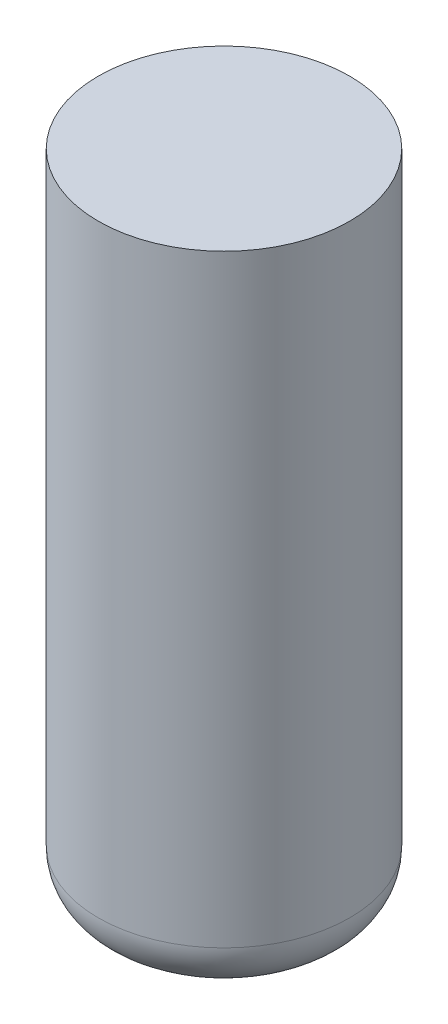
ISO-10303-21;
HEADER;
FILE_DESCRIPTION(('STEP AP214'),'2;1');
FILE_NAME('part.step','',(''),(''),'','','');
FILE_SCHEMA(('AUTOMOTIVE_DESIGN { 1 0 10303 214 1 1 1 1 }'));
ENDSEC;
DATA;
#1=APPLICATION_CONTEXT('core data for automotive mechanical design processes');
#2=APPLICATION_PROTOCOL_DEFINITION('international standard','automotive_design',2000,#1);
#3=PRODUCT_CONTEXT('',#1,'mechanical');
#4=PRODUCT('Part','Part','',(#3));
#5=PRODUCT_RELATED_PRODUCT_CATEGORY('part','',(#4));
#6=PRODUCT_DEFINITION_FORMATION('','',#4);
#7=PRODUCT_DEFINITION_CONTEXT('part definition',#1,'design');
#8=PRODUCT_DEFINITION('design','',#6,#7);
#9=PRODUCT_DEFINITION_SHAPE('','',#8);
#10=(LENGTH_UNIT() NAMED_UNIT(*) SI_UNIT(.MILLI.,.METRE.));
#11=(NAMED_UNIT(*) PLANE_ANGLE_UNIT() SI_UNIT($,.RADIAN.));
#12=(NAMED_UNIT(*) SI_UNIT($,.STERADIAN.) SOLID_ANGLE_UNIT());
#13=UNCERTAINTY_MEASURE_WITH_UNIT(LENGTH_MEASURE(1.E-05),#10,'distance_accuracy_value','');
#14=(GEOMETRIC_REPRESENTATION_CONTEXT(3) GLOBAL_UNCERTAINTY_ASSIGNED_CONTEXT((#13)) GLOBAL_UNIT_ASSIGNED_CONTEXT((#10,
#11,#12)) REPRESENTATION_CONTEXT('',''));
#15=CARTESIAN_POINT('',(0.,0.,0.));
#16=DIRECTION('',(0.,0.,1.));
#17=DIRECTION('',(1.,0.,0.));
#18=AXIS2_PLACEMENT_3D('',#15,#16,#17);
#19=CARTESIAN_POINT('',(-2.5,-1.8,5.960464455335E-08));
#20=DIRECTION('',(0.,-1.,0.));
#21=DIRECTION('',(0.,0.,-1.));
#22=AXIS2_PLACEMENT_3D('',#19,#20,#21);
#23=TOROIDAL_SURFACE('',#22,0.3,0.2);
#24=CARTESIAN_POINT('',(-2.5,-2.,5.960464455335E-08));
#25=DIRECTION('',(0.,1.,0.));
#26=DIRECTION('',(1.,0.,0.));
#27=AXIS2_PLACEMENT_3D('',#24,#25,#26);
#28=CIRCLE('',#27,0.3);
#29=CARTESIAN_POINT('',(-2.8,-2.,5.960464459009E-08));
#30=VERTEX_POINT('',#29);
#31=CARTESIAN_POINT('',(-2.5,-2.,0.300000059605));
#32=VERTEX_POINT('',#31);
#33=EDGE_CURVE('E11',#30,#32,#28,.T.);
#34=ORIENTED_EDGE('',*,*,#33,.T.);
#35=CARTESIAN_POINT('',(-2.5,-1.8,0.300000059605));
#36=DIRECTION('',(-1.,0.,0.));
#37=DIRECTION('',(0.,0.,1.));
#38=AXIS2_PLACEMENT_3D('',#35,#36,#37);
#39=CIRCLE('',#38,0.2);
#40=CARTESIAN_POINT('',(-2.5,-1.8,0.500000059605));
#41=VERTEX_POINT('',#40);
#42=EDGE_CURVE('E24',#32,#41,#39,.T.);
#43=ORIENTED_EDGE('',*,*,#42,.T.);
#44=CARTESIAN_POINT('',(-2.5,-1.8,5.960464455335E-08));
#45=DIRECTION('',(0.,-1.,0.));
#46=DIRECTION('',(1.,0.,0.));
#47=AXIS2_PLACEMENT_3D('',#44,#45,#46);
#48=CIRCLE('',#47,0.5);
#49=CARTESIAN_POINT('',(-3.,-1.8,5.960464449211E-08));
#50=VERTEX_POINT('',#49);
#51=EDGE_CURVE('E58',#41,#50,#48,.T.);
#52=ORIENTED_EDGE('',*,*,#51,.T.);
#53=CARTESIAN_POINT('',(-2.5,-1.8,5.960464455335E-08));
#54=DIRECTION('',(0.,-1.,0.));
#55=DIRECTION('',(1.,0.,0.));
#56=AXIS2_PLACEMENT_3D('',#53,#54,#55);
#57=CIRCLE('',#56,0.5);
#58=EDGE_CURVE('E51',#50,#41,#57,.T.);
#59=ORIENTED_EDGE('',*,*,#58,.T.);
#60=ORIENTED_EDGE('',*,*,#42,.F.);
#61=CARTESIAN_POINT('',(-2.5,-2.,5.960464455335E-08));
#62=DIRECTION('',(0.,1.,0.));
#63=DIRECTION('',(1.,0.,0.));
#64=AXIS2_PLACEMENT_3D('',#61,#62,#63);
#65=CIRCLE('',#64,0.3);
#66=EDGE_CURVE('E52',#32,#30,#65,.T.);
#67=ORIENTED_EDGE('',*,*,#66,.T.);
#68=EDGE_LOOP('',(#34,#43,#52,#59,#60,#67));
#69=FACE_BOUND('',#68,.T.);
#70=ADVANCED_FACE('F17',(#69),#23,.T.);
#71=CARTESIAN_POINT('',(-2.5,0.6,5.960464455335E-08));
#72=DIRECTION('',(0.,-1.,0.));
#73=DIRECTION('',(1.,0.,0.));
#74=AXIS2_PLACEMENT_3D('',#71,#72,#73);
#75=CYLINDRICAL_SURFACE('',#74,0.5);
#76=ORIENTED_EDGE('',*,*,#58,.F.);
#77=DIRECTION('',(0.,1.,0.));
#78=VECTOR('',#77,1.);
#79=CARTESIAN_POINT('',(-3.,0.6,5.960464449211E-08));
#80=LINE('',#79,#78);
#81=CARTESIAN_POINT('',(-3.,0.6,5.960464449211E-08));
#82=VERTEX_POINT('',#81);
#83=EDGE_CURVE('E45',#50,#82,#80,.T.);
#84=ORIENTED_EDGE('',*,*,#83,.T.);
#85=CARTESIAN_POINT('',(-2.5,0.6,5.960464455335E-08));
#86=DIRECTION('',(0.,-1.,0.));
#87=DIRECTION('',(1.,0.,0.));
#88=AXIS2_PLACEMENT_3D('',#85,#86,#87);
#89=CIRCLE('',#88,0.5);
#90=EDGE_CURVE('E48',#82,#82,#89,.T.);
#91=ORIENTED_EDGE('',*,*,#90,.T.);
#92=ORIENTED_EDGE('',*,*,#83,.F.);
#93=ORIENTED_EDGE('',*,*,#51,.F.);
#94=EDGE_LOOP('',(#76,#84,#91,#92,#93));
#95=FACE_BOUND('',#94,.T.);
#96=ADVANCED_FACE('F46',(#95),#75,.T.);
#97=CARTESIAN_POINT('',(-2.5,-2.,5.960464455335E-08));
#98=DIRECTION('',(0.,-1.,0.));
#99=DIRECTION('',(1.,0.,0.));
#100=AXIS2_PLACEMENT_3D('',#97,#98,#99);
#101=PLANE('',#100);
#102=ORIENTED_EDGE('',*,*,#33,.F.);
#103=ORIENTED_EDGE('',*,*,#66,.F.);
#104=EDGE_LOOP('',(#102,#103));
#105=FACE_BOUND('',#104,.T.);
#106=ADVANCED_FACE('F59',(#105),#101,.T.);
#107=CARTESIAN_POINT('',(-2.5,0.6,5.960464455335E-08));
#108=DIRECTION('',(0.,-1.,0.));
#109=DIRECTION('',(1.,0.,0.));
#110=AXIS2_PLACEMENT_3D('',#107,#108,#109);
#111=PLANE('',#110);
#112=ORIENTED_EDGE('',*,*,#90,.F.);
#113=EDGE_LOOP('',(#112));
#114=FACE_BOUND('',#113,.T.);
#115=ADVANCED_FACE('F61',(#114),#111,.F.);
#116=CLOSED_SHELL('',(#70,#96,#106,#115));
#117=MANIFOLD_SOLID_BREP('B1',#116);
#118=ADVANCED_BREP_SHAPE_REPRESENTATION('',(#18,#117),#14);
#119=SHAPE_DEFINITION_REPRESENTATION(#9,#118);
ENDSEC;
END-ISO-10303-21;
